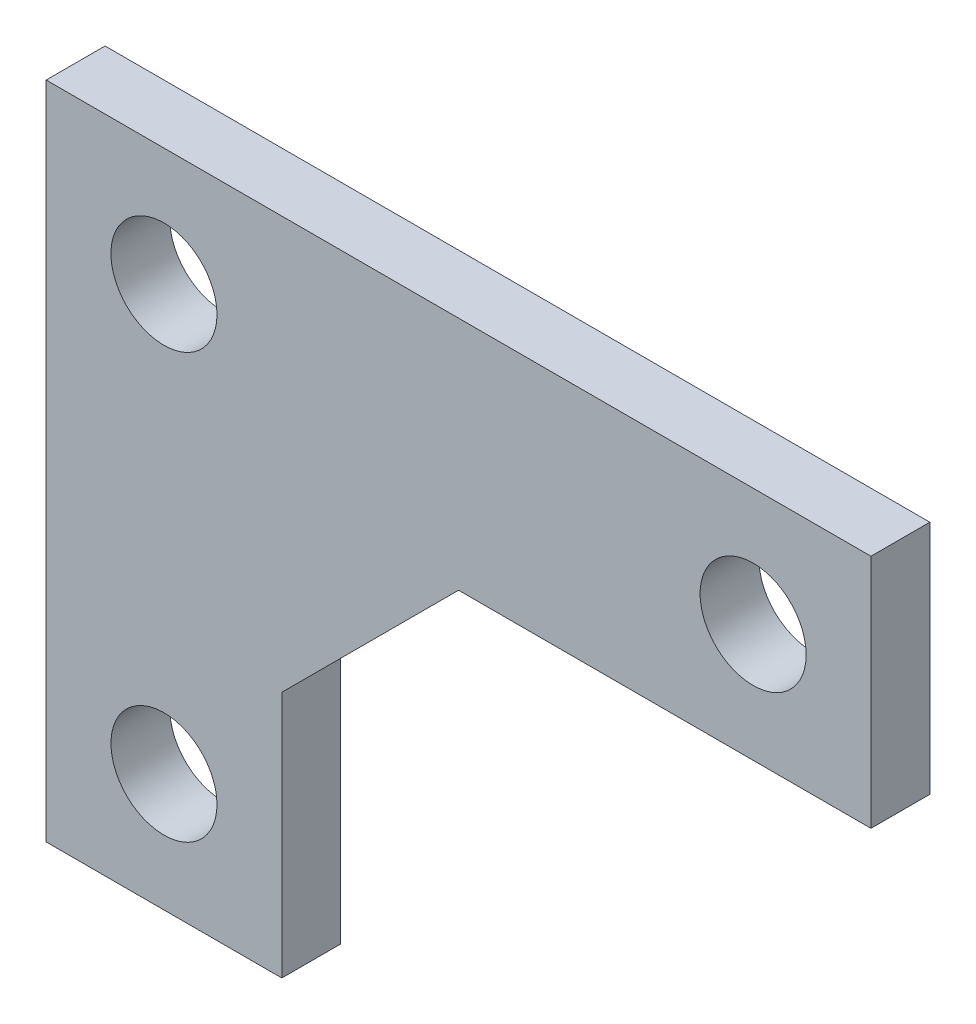
ISO-10303-21;
HEADER;
FILE_DESCRIPTION(('STEP AP214'),'2;1');
FILE_NAME('part.step','',(''),(''),'','','');
FILE_SCHEMA(('AUTOMOTIVE_DESIGN { 1 0 10303 214 1 1 1 1 }'));
ENDSEC;
DATA;
#1=APPLICATION_CONTEXT('core data for automotive mechanical design processes');
#2=APPLICATION_PROTOCOL_DEFINITION('international standard','automotive_design',2000,#1);
#3=PRODUCT_CONTEXT('',#1,'mechanical');
#4=PRODUCT('Part','Part','',(#3));
#5=PRODUCT_RELATED_PRODUCT_CATEGORY('part','',(#4));
#6=PRODUCT_DEFINITION_FORMATION('','',#4);
#7=PRODUCT_DEFINITION_CONTEXT('part definition',#1,'design');
#8=PRODUCT_DEFINITION('design','',#6,#7);
#9=PRODUCT_DEFINITION_SHAPE('','',#8);
#10=(LENGTH_UNIT() NAMED_UNIT(*) SI_UNIT(.MILLI.,.METRE.));
#11=(NAMED_UNIT(*) PLANE_ANGLE_UNIT() SI_UNIT($,.RADIAN.));
#12=(NAMED_UNIT(*) SI_UNIT($,.STERADIAN.) SOLID_ANGLE_UNIT());
#13=UNCERTAINTY_MEASURE_WITH_UNIT(LENGTH_MEASURE(1.E-05),#10,'distance_accuracy_value','');
#14=(GEOMETRIC_REPRESENTATION_CONTEXT(3) GLOBAL_UNCERTAINTY_ASSIGNED_CONTEXT((#13)) GLOBAL_UNIT_ASSIGNED_CONTEXT((#10,
#11,#12)) REPRESENTATION_CONTEXT('',''));
#15=CARTESIAN_POINT('',(0.,0.,0.));
#16=DIRECTION('',(0.,0.,1.));
#17=DIRECTION('',(1.,0.,0.));
#18=AXIS2_PLACEMENT_3D('',#15,#16,#17);
#19=CARTESIAN_POINT('',(10.,26.,-5.));
#20=DIRECTION('',(1.,0.,0.));
#21=DIRECTION('',(0.,0.,-1.));
#22=AXIS2_PLACEMENT_3D('',#19,#20,#21);
#23=PLANE('',#22);
#24=DIRECTION('',(0.,1.,0.));
#25=VECTOR('',#24,1.);
#26=CARTESIAN_POINT('',(10.,10.,-5.));
#27=LINE('',#26,#25);
#28=CARTESIAN_POINT('',(10.,-10.,-5.));
#29=VERTEX_POINT('',#28);
#30=CARTESIAN_POINT('',(10.,10.9999999999999,-5.));
#31=VERTEX_POINT('',#30);
#32=EDGE_CURVE('E114',#29,#31,#27,.T.);
#33=ORIENTED_EDGE('',*,*,#32,.T.);
#34=DIRECTION('',(0.,0.,1.));
#35=VECTOR('',#34,1.);
#36=CARTESIAN_POINT('',(10.,10.9999999999999,0.));
#37=LINE('',#36,#35);
#38=CARTESIAN_POINT('',(10.,10.9999999999999,0.));
#39=VERTEX_POINT('',#38);
#40=EDGE_CURVE('E148',#31,#39,#37,.T.);
#41=ORIENTED_EDGE('',*,*,#40,.T.);
#42=DIRECTION('',(0.,1.,0.));
#43=VECTOR('',#42,1.);
#44=CARTESIAN_POINT('',(10.,26.,0.));
#45=LINE('',#44,#43);
#46=CARTESIAN_POINT('',(10.,-10.,0.));
#47=VERTEX_POINT('',#46);
#48=EDGE_CURVE('E105',#47,#39,#45,.T.);
#49=ORIENTED_EDGE('',*,*,#48,.F.);
#50=DIRECTION('',(0.,0.,1.));
#51=VECTOR('',#50,1.);
#52=CARTESIAN_POINT('',(10.,-10.,-5.));
#53=LINE('',#52,#51);
#54=EDGE_CURVE('E145',#29,#47,#53,.T.);
#55=ORIENTED_EDGE('',*,*,#54,.F.);
#56=EDGE_LOOP('',(#33,#41,#49,#55));
#57=FACE_BOUND('',#56,.T.);
#58=ADVANCED_FACE('F40',(#57),#23,.T.);
#59=CARTESIAN_POINT('',(-10.,-10.,-5.));
#60=DIRECTION('',(0.,-1.,0.));
#61=DIRECTION('',(0.,0.,-1.));
#62=AXIS2_PLACEMENT_3D('',#59,#60,#61);
#63=PLANE('',#62);
#64=DIRECTION('',(1.,0.,0.));
#65=VECTOR('',#64,1.);
#66=CARTESIAN_POINT('',(-10.,-10.,0.));
#67=LINE('',#66,#65);
#68=CARTESIAN_POINT('',(-10.,-10.,0.));
#69=VERTEX_POINT('',#68);
#70=EDGE_CURVE('E141',#69,#47,#67,.T.);
#71=ORIENTED_EDGE('',*,*,#70,.F.);
#72=DIRECTION('',(0.,0.,1.));
#73=VECTOR('',#72,1.);
#74=CARTESIAN_POINT('',(-10.,-10.,-5.));
#75=LINE('',#74,#73);
#76=CARTESIAN_POINT('',(-10.,-10.,-5.));
#77=VERTEX_POINT('',#76);
#78=EDGE_CURVE('E149',#77,#69,#75,.T.);
#79=ORIENTED_EDGE('',*,*,#78,.F.);
#80=DIRECTION('',(1.,0.,0.));
#81=VECTOR('',#80,1.);
#82=CARTESIAN_POINT('',(-10.,-10.,-5.));
#83=LINE('',#82,#81);
#84=EDGE_CURVE('E126',#77,#29,#83,.T.);
#85=ORIENTED_EDGE('',*,*,#84,.T.);
#86=ORIENTED_EDGE('',*,*,#54,.T.);
#87=EDGE_LOOP('',(#71,#79,#85,#86));
#88=FACE_BOUND('',#87,.T.);
#89=ADVANCED_FACE('F165',(#88),#63,.T.);
#90=CARTESIAN_POINT('',(-10.,10.,-5.));
#91=DIRECTION('',(-1.,0.,0.));
#92=DIRECTION('',(0.,0.,1.));
#93=AXIS2_PLACEMENT_3D('',#90,#91,#92);
#94=PLANE('',#93);
#95=DIRECTION('',(0.,-1.,0.));
#96=VECTOR('',#95,1.);
#97=CARTESIAN_POINT('',(-10.,10.,0.));
#98=LINE('',#97,#96);
#99=CARTESIAN_POINT('',(-10.,46.,0.));
#100=VERTEX_POINT('',#99);
#101=EDGE_CURVE('E138',#100,#69,#98,.T.);
#102=ORIENTED_EDGE('',*,*,#101,.F.);
#103=DIRECTION('',(0.,0.,1.));
#104=VECTOR('',#103,1.);
#105=CARTESIAN_POINT('',(-10.,46.,-5.));
#106=LINE('',#105,#104);
#107=CARTESIAN_POINT('',(-10.,46.,-5.));
#108=VERTEX_POINT('',#107);
#109=EDGE_CURVE('E151',#108,#100,#106,.T.);
#110=ORIENTED_EDGE('',*,*,#109,.F.);
#111=DIRECTION('',(0.,-1.,0.));
#112=VECTOR('',#111,1.);
#113=CARTESIAN_POINT('',(-10.,46.,-5.));
#114=LINE('',#113,#112);
#115=EDGE_CURVE('E121',#108,#77,#114,.T.);
#116=ORIENTED_EDGE('',*,*,#115,.T.);
#117=ORIENTED_EDGE('',*,*,#78,.T.);
#118=EDGE_LOOP('',(#102,#110,#116,#117));
#119=FACE_BOUND('',#118,.T.);
#120=ADVANCED_FACE('F180',(#119),#94,.T.);
#121=CARTESIAN_POINT('',(-10.,46.,-5.));
#122=DIRECTION('',(0.,1.,0.));
#123=DIRECTION('',(0.,0.,1.));
#124=AXIS2_PLACEMENT_3D('',#121,#122,#123);
#125=PLANE('',#124);
#126=DIRECTION('',(-1.,0.,0.));
#127=VECTOR('',#126,1.);
#128=CARTESIAN_POINT('',(-10.,46.,0.));
#129=LINE('',#128,#127);
#130=CARTESIAN_POINT('',(60.,46.,0.));
#131=VERTEX_POINT('',#130);
#132=EDGE_CURVE('E135',#131,#100,#129,.T.);
#133=ORIENTED_EDGE('',*,*,#132,.F.);
#134=DIRECTION('',(0.,0.,1.));
#135=VECTOR('',#134,1.);
#136=CARTESIAN_POINT('',(60.,46.,-5.));
#137=LINE('',#136,#135);
#138=CARTESIAN_POINT('',(60.,46.,-5.));
#139=VERTEX_POINT('',#138);
#140=EDGE_CURVE('E113',#139,#131,#137,.T.);
#141=ORIENTED_EDGE('',*,*,#140,.F.);
#142=DIRECTION('',(-1.,0.,0.));
#143=VECTOR('',#142,1.);
#144=CARTESIAN_POINT('',(40.,46.,-5.));
#145=LINE('',#144,#143);
#146=EDGE_CURVE('E119',#139,#108,#145,.T.);
#147=ORIENTED_EDGE('',*,*,#146,.T.);
#148=ORIENTED_EDGE('',*,*,#109,.T.);
#149=EDGE_LOOP('',(#133,#141,#147,#148));
#150=FACE_BOUND('',#149,.T.);
#151=ADVANCED_FACE('F187',(#150),#125,.T.);
#152=CARTESIAN_POINT('',(60.,46.,-5.));
#153=DIRECTION('',(1.,0.,0.));
#154=DIRECTION('',(0.,0.,-1.));
#155=AXIS2_PLACEMENT_3D('',#152,#153,#154);
#156=PLANE('',#155);
#157=DIRECTION('',(0.,1.,0.));
#158=VECTOR('',#157,1.);
#159=CARTESIAN_POINT('',(60.,46.,0.));
#160=LINE('',#159,#158);
#161=CARTESIAN_POINT('',(60.,26.,0.));
#162=VERTEX_POINT('',#161);
#163=EDGE_CURVE('E112',#162,#131,#160,.T.);
#164=ORIENTED_EDGE('',*,*,#163,.F.);
#165=DIRECTION('',(0.,0.,1.));
#166=VECTOR('',#165,1.);
#167=CARTESIAN_POINT('',(60.,26.,-5.));
#168=LINE('',#167,#166);
#169=CARTESIAN_POINT('',(60.,26.,-5.));
#170=VERTEX_POINT('',#169);
#171=EDGE_CURVE('E99',#170,#162,#168,.T.);
#172=ORIENTED_EDGE('',*,*,#171,.F.);
#173=DIRECTION('',(0.,1.,0.));
#174=VECTOR('',#173,1.);
#175=CARTESIAN_POINT('',(60.,46.,-5.));
#176=LINE('',#175,#174);
#177=EDGE_CURVE('E104',#170,#139,#176,.T.);
#178=ORIENTED_EDGE('',*,*,#177,.T.);
#179=ORIENTED_EDGE('',*,*,#140,.T.);
#180=EDGE_LOOP('',(#164,#172,#178,#179));
#181=FACE_BOUND('',#180,.T.);
#182=ADVANCED_FACE('F109',(#181),#156,.T.);
#183=CARTESIAN_POINT('',(40.,26.,-5.));
#184=DIRECTION('',(0.,-1.,0.));
#185=DIRECTION('',(1.,0.,0.));
#186=AXIS2_PLACEMENT_3D('',#183,#184,#185);
#187=PLANE('',#186);
#188=DIRECTION('',(1.,0.,0.));
#189=VECTOR('',#188,1.);
#190=CARTESIAN_POINT('',(40.,26.,0.));
#191=LINE('',#190,#189);
#192=CARTESIAN_POINT('',(24.9999999999999,26.,0.));
#193=VERTEX_POINT('',#192);
#194=EDGE_CURVE('E131',#193,#162,#191,.T.);
#195=ORIENTED_EDGE('',*,*,#194,.F.);
#196=DIRECTION('',(0.,0.,-1.));
#197=VECTOR('',#196,1.);
#198=CARTESIAN_POINT('',(24.9999999999999,26.,-5.));
#199=LINE('',#198,#197);
#200=CARTESIAN_POINT('',(24.9999999999999,26.,-5.));
#201=VERTEX_POINT('',#200);
#202=EDGE_CURVE('E56',#193,#201,#199,.T.);
#203=ORIENTED_EDGE('',*,*,#202,.T.);
#204=DIRECTION('',(1.,0.,0.));
#205=VECTOR('',#204,1.);
#206=CARTESIAN_POINT('',(10.,26.,-5.));
#207=LINE('',#206,#205);
#208=EDGE_CURVE('E96',#201,#170,#207,.T.);
#209=ORIENTED_EDGE('',*,*,#208,.T.);
#210=ORIENTED_EDGE('',*,*,#171,.T.);
#211=EDGE_LOOP('',(#195,#203,#209,#210));
#212=FACE_BOUND('',#211,.T.);
#213=ADVANCED_FACE('F98',(#212),#187,.T.);
#214=CARTESIAN_POINT('',(0.,0.,-5.));
#215=DIRECTION('',(0.,0.,-1.));
#216=DIRECTION('',(-1.,0.,0.));
#217=AXIS2_PLACEMENT_3D('',#214,#215,#216);
#218=PLANE('',#217);
#219=CARTESIAN_POINT('',(50.,36.,-5.));
#220=DIRECTION('',(0.,0.,1.));
#221=DIRECTION('',(1.,0.,0.));
#222=AXIS2_PLACEMENT_3D('',#219,#220,#221);
#223=CIRCLE('',#222,4.50000000000001);
#224=CARTESIAN_POINT('',(54.5,36.,-5.));
#225=VERTEX_POINT('',#224);
#226=EDGE_CURVE('E221',#225,#225,#223,.T.);
#227=ORIENTED_EDGE('',*,*,#226,.T.);
#228=EDGE_LOOP('',(#227));
#229=FACE_BOUND('',#228,.T.);
#230=CARTESIAN_POINT('',(0.,36.,-5.));
#231=DIRECTION('',(0.,0.,1.));
#232=DIRECTION('',(1.,0.,0.));
#233=AXIS2_PLACEMENT_3D('',#230,#231,#232);
#234=CIRCLE('',#233,4.5);
#235=CARTESIAN_POINT('',(4.5,36.,-5.));
#236=VERTEX_POINT('',#235);
#237=EDGE_CURVE('E216',#236,#236,#234,.T.);
#238=ORIENTED_EDGE('',*,*,#237,.T.);
#239=EDGE_LOOP('',(#238));
#240=FACE_BOUND('',#239,.T.);
#241=CARTESIAN_POINT('',(0.,0.,-5.));
#242=DIRECTION('',(0.,0.,1.));
#243=DIRECTION('',(1.,0.,0.));
#244=AXIS2_PLACEMENT_3D('',#241,#242,#243);
#245=CIRCLE('',#244,4.5);
#246=CARTESIAN_POINT('',(4.5,0.,-5.));
#247=VERTEX_POINT('',#246);
#248=EDGE_CURVE('E133',#247,#247,#245,.T.);
#249=ORIENTED_EDGE('',*,*,#248,.T.);
#250=EDGE_LOOP('',(#249));
#251=FACE_BOUND('',#250,.T.);
#252=ORIENTED_EDGE('',*,*,#208,.F.);
#253=DIRECTION('',(0.707106781186544,0.707106781186551,0.));
#254=VECTOR('',#253,1.);
#255=CARTESIAN_POINT('',(10.,10.9999999999999,-5.));
#256=LINE('',#255,#254);
#257=EDGE_CURVE('E11',#201,#31,#256,.F.);
#258=ORIENTED_EDGE('',*,*,#257,.T.);
#259=ORIENTED_EDGE('',*,*,#32,.F.);
#260=ORIENTED_EDGE('',*,*,#84,.F.);
#261=ORIENTED_EDGE('',*,*,#115,.F.);
#262=ORIENTED_EDGE('',*,*,#146,.F.);
#263=ORIENTED_EDGE('',*,*,#177,.F.);
#264=EDGE_LOOP('',(#252,#258,#259,#260,#261,#262,#263));
#265=FACE_BOUND('',#264,.T.);
#266=ADVANCED_FACE('F117',(#229,#240,#251,#265),#218,.T.);
#267=CARTESIAN_POINT('',(0.,0.,0.));
#268=DIRECTION('',(0.,0.,-1.));
#269=DIRECTION('',(-1.,0.,0.));
#270=AXIS2_PLACEMENT_3D('',#267,#268,#269);
#271=PLANE('',#270);
#272=CARTESIAN_POINT('',(50.,36.,0.));
#273=DIRECTION('',(0.,0.,1.));
#274=DIRECTION('',(1.,0.,0.));
#275=AXIS2_PLACEMENT_3D('',#272,#273,#274);
#276=CIRCLE('',#275,4.50000000000001);
#277=CARTESIAN_POINT('',(54.5,36.,0.));
#278=VERTEX_POINT('',#277);
#279=EDGE_CURVE('E225',#278,#278,#276,.T.);
#280=ORIENTED_EDGE('',*,*,#279,.F.);
#281=EDGE_LOOP('',(#280));
#282=FACE_BOUND('',#281,.T.);
#283=CARTESIAN_POINT('',(0.,36.,0.));
#284=DIRECTION('',(0.,0.,1.));
#285=DIRECTION('',(1.,0.,0.));
#286=AXIS2_PLACEMENT_3D('',#283,#284,#285);
#287=CIRCLE('',#286,4.5);
#288=CARTESIAN_POINT('',(4.5,36.,0.));
#289=VERTEX_POINT('',#288);
#290=EDGE_CURVE('E219',#289,#289,#287,.T.);
#291=ORIENTED_EDGE('',*,*,#290,.F.);
#292=EDGE_LOOP('',(#291));
#293=FACE_BOUND('',#292,.T.);
#294=CARTESIAN_POINT('',(0.,0.,0.));
#295=DIRECTION('',(0.,0.,1.));
#296=DIRECTION('',(1.,0.,0.));
#297=AXIS2_PLACEMENT_3D('',#294,#295,#296);
#298=CIRCLE('',#297,4.5);
#299=CARTESIAN_POINT('',(4.5,0.,0.));
#300=VERTEX_POINT('',#299);
#301=EDGE_CURVE('E223',#300,#300,#298,.T.);
#302=ORIENTED_EDGE('',*,*,#301,.F.);
#303=EDGE_LOOP('',(#302));
#304=FACE_BOUND('',#303,.T.);
#305=ORIENTED_EDGE('',*,*,#48,.T.);
#306=DIRECTION('',(-0.707106781186544,-0.707106781186551,0.));
#307=VECTOR('',#306,1.);
#308=CARTESIAN_POINT('',(-0.499999999999898,0.499999999999892,0.));
#309=LINE('',#308,#307);
#310=EDGE_CURVE('E49',#39,#193,#309,.F.);
#311=ORIENTED_EDGE('',*,*,#310,.T.);
#312=ORIENTED_EDGE('',*,*,#194,.T.);
#313=ORIENTED_EDGE('',*,*,#163,.T.);
#314=ORIENTED_EDGE('',*,*,#132,.T.);
#315=ORIENTED_EDGE('',*,*,#101,.T.);
#316=ORIENTED_EDGE('',*,*,#70,.T.);
#317=EDGE_LOOP('',(#305,#311,#312,#313,#314,#315,#316));
#318=FACE_BOUND('',#317,.T.);
#319=ADVANCED_FACE('F161',(#282,#293,#304,#318),#271,.F.);
#320=CARTESIAN_POINT('',(0.,0.,-5.));
#321=DIRECTION('',(0.,0.,1.));
#322=DIRECTION('',(1.,0.,0.));
#323=AXIS2_PLACEMENT_3D('',#320,#321,#322);
#324=CYLINDRICAL_SURFACE('',#323,4.5);
#325=ORIENTED_EDGE('',*,*,#248,.F.);
#326=EDGE_LOOP('',(#325));
#327=FACE_BOUND('',#326,.T.);
#328=ORIENTED_EDGE('',*,*,#301,.T.);
#329=EDGE_LOOP('',(#328));
#330=FACE_BOUND('',#329,.T.);
#331=ADVANCED_FACE('F201',(#327,#330),#324,.F.);
#332=CARTESIAN_POINT('',(0.,36.,-5.));
#333=DIRECTION('',(0.,0.,1.));
#334=DIRECTION('',(1.,0.,0.));
#335=AXIS2_PLACEMENT_3D('',#332,#333,#334);
#336=CYLINDRICAL_SURFACE('',#335,4.5);
#337=ORIENTED_EDGE('',*,*,#237,.F.);
#338=EDGE_LOOP('',(#337));
#339=FACE_BOUND('',#338,.T.);
#340=ORIENTED_EDGE('',*,*,#290,.T.);
#341=EDGE_LOOP('',(#340));
#342=FACE_BOUND('',#341,.T.);
#343=ADVANCED_FACE('F172',(#339,#342),#336,.F.);
#344=CARTESIAN_POINT('',(50.,36.,-5.));
#345=DIRECTION('',(0.,0.,1.));
#346=DIRECTION('',(1.,0.,0.));
#347=AXIS2_PLACEMENT_3D('',#344,#345,#346);
#348=CYLINDRICAL_SURFACE('',#347,4.50000000000001);
#349=ORIENTED_EDGE('',*,*,#226,.F.);
#350=EDGE_LOOP('',(#349));
#351=FACE_BOUND('',#350,.T.);
#352=ORIENTED_EDGE('',*,*,#279,.T.);
#353=EDGE_LOOP('',(#352));
#354=FACE_BOUND('',#353,.T.);
#355=ADVANCED_FACE('F168',(#351,#354),#348,.F.);
#356=CARTESIAN_POINT('',(10.,10.9999999999999,-5.));
#357=DIRECTION('',(0.707106781186551,-0.707106781186544,0.));
#358=DIRECTION('',(0.,0.,-1.));
#359=AXIS2_PLACEMENT_3D('',#356,#357,#358);
#360=PLANE('',#359);
#361=ORIENTED_EDGE('',*,*,#257,.F.);
#362=ORIENTED_EDGE('',*,*,#202,.F.);
#363=ORIENTED_EDGE('',*,*,#310,.F.);
#364=ORIENTED_EDGE('',*,*,#40,.F.);
#365=EDGE_LOOP('',(#361,#362,#363,#364));
#366=FACE_BOUND('',#365,.T.);
#367=ADVANCED_FACE('F43',(#366),#360,.T.);
#368=CLOSED_SHELL('',(#58,#89,#120,#151,#182,#213,#266,#319,#331,#343,#355,#367));
#369=MANIFOLD_SOLID_BREP('B2',#368);
#370=ADVANCED_BREP_SHAPE_REPRESENTATION('',(#18,#369),#14);
#371=SHAPE_DEFINITION_REPRESENTATION(#9,#370);
ENDSEC;
END-ISO-10303-21;
